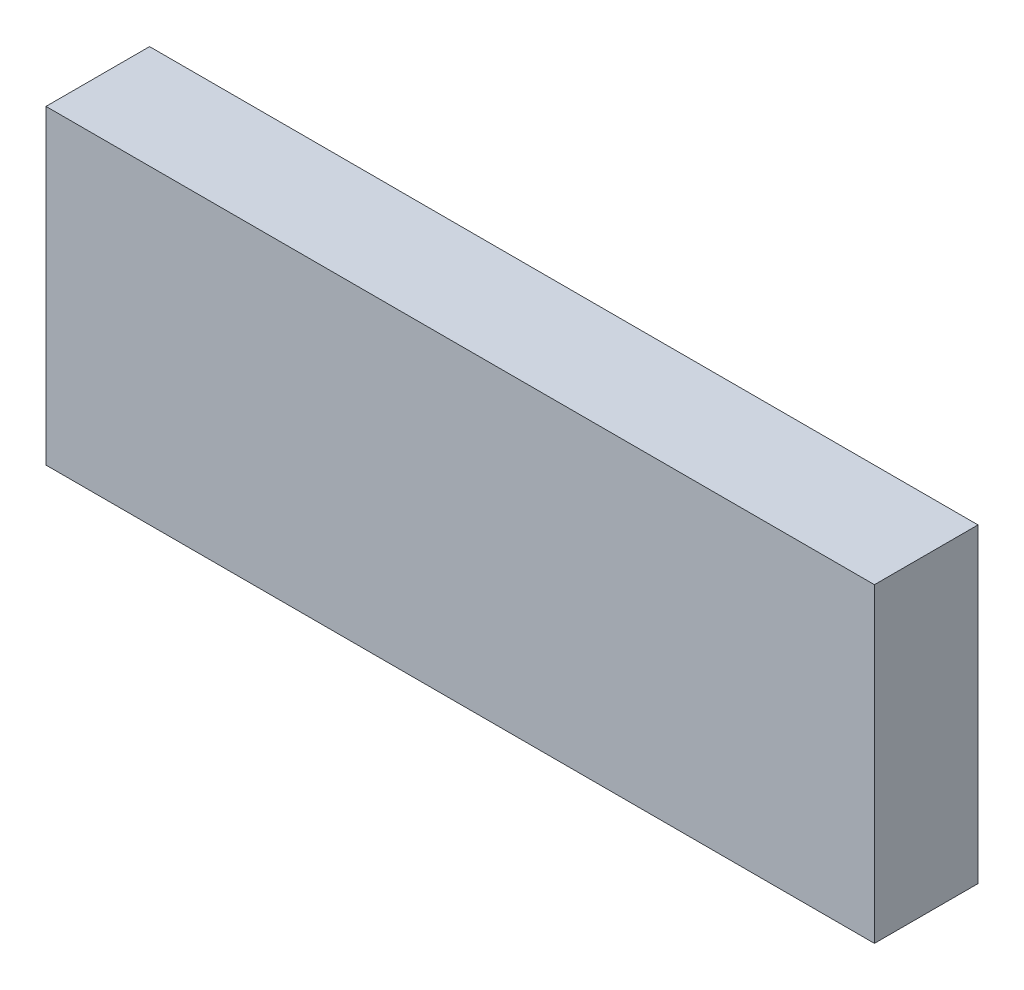
ISO-10303-21;
HEADER;
FILE_DESCRIPTION(('STEP AP214'),'2;1');
FILE_NAME('part.step','',(''),(''),'','','');
FILE_SCHEMA(('AUTOMOTIVE_DESIGN { 1 0 10303 214 1 1 1 1 }'));
ENDSEC;
DATA;
#1=APPLICATION_CONTEXT('core data for automotive mechanical design processes');
#2=APPLICATION_PROTOCOL_DEFINITION('international standard','automotive_design',2000,#1);
#3=PRODUCT_CONTEXT('',#1,'mechanical');
#4=PRODUCT('Part','Part','',(#3));
#5=PRODUCT_RELATED_PRODUCT_CATEGORY('part','',(#4));
#6=PRODUCT_DEFINITION_FORMATION('','',#4);
#7=PRODUCT_DEFINITION_CONTEXT('part definition',#1,'design');
#8=PRODUCT_DEFINITION('design','',#6,#7);
#9=PRODUCT_DEFINITION_SHAPE('','',#8);
#10=(LENGTH_UNIT() NAMED_UNIT(*) SI_UNIT(.MILLI.,.METRE.));
#11=(NAMED_UNIT(*) PLANE_ANGLE_UNIT() SI_UNIT($,.RADIAN.));
#12=(NAMED_UNIT(*) SI_UNIT($,.STERADIAN.) SOLID_ANGLE_UNIT());
#13=UNCERTAINTY_MEASURE_WITH_UNIT(LENGTH_MEASURE(1.E-05),#10,'distance_accuracy_value','');
#14=(GEOMETRIC_REPRESENTATION_CONTEXT(3) GLOBAL_UNCERTAINTY_ASSIGNED_CONTEXT((#13)) GLOBAL_UNIT_ASSIGNED_CONTEXT((#10,
#11,#12)) REPRESENTATION_CONTEXT('',''));
#15=CARTESIAN_POINT('',(0.,0.,0.));
#16=DIRECTION('',(0.,0.,1.));
#17=DIRECTION('',(1.,0.,0.));
#18=AXIS2_PLACEMENT_3D('',#15,#16,#17);
#19=CARTESIAN_POINT('',(342.,-70.,2.));
#20=DIRECTION('',(0.,0.,1.));
#21=DIRECTION('',(1.,0.,0.));
#22=AXIS2_PLACEMENT_3D('',#19,#20,#21);
#23=PLANE('',#22);
#24=DIRECTION('',(0.,1.,0.));
#25=VECTOR('',#24,1.);
#26=CARTESIAN_POINT('',(342.,-70.,2.));
#27=LINE('',#26,#25);
#28=CARTESIAN_POINT('',(342.,-70.,2.));
#29=VERTEX_POINT('',#28);
#30=CARTESIAN_POINT('',(342.,-64.,2.));
#31=VERTEX_POINT('',#30);
#32=EDGE_CURVE('E87',#29,#31,#27,.T.);
#33=ORIENTED_EDGE('',*,*,#32,.F.);
#34=DIRECTION('',(1.,0.,0.));
#35=VECTOR('',#34,1.);
#36=CARTESIAN_POINT('',(342.,-70.,2.));
#37=LINE('',#36,#35);
#38=CARTESIAN_POINT('',(358.,-70.,2.));
#39=VERTEX_POINT('',#38);
#40=EDGE_CURVE('E67',#29,#39,#37,.T.);
#41=ORIENTED_EDGE('',*,*,#40,.T.);
#42=DIRECTION('',(0.,1.,0.));
#43=VECTOR('',#42,1.);
#44=CARTESIAN_POINT('',(358.,-70.,2.));
#45=LINE('',#44,#43);
#46=CARTESIAN_POINT('',(358.,-64.,2.));
#47=VERTEX_POINT('',#46);
#48=EDGE_CURVE('E81',#39,#47,#45,.T.);
#49=ORIENTED_EDGE('',*,*,#48,.T.);
#50=DIRECTION('',(1.,0.,0.));
#51=VECTOR('',#50,1.);
#52=CARTESIAN_POINT('',(342.,-64.,2.));
#53=LINE('',#52,#51);
#54=EDGE_CURVE('E9',#31,#47,#53,.T.);
#55=ORIENTED_EDGE('',*,*,#54,.F.);
#56=EDGE_LOOP('',(#33,#41,#49,#55));
#57=FACE_BOUND('',#56,.T.);
#58=ADVANCED_FACE('F15',(#57),#23,.T.);
#59=CARTESIAN_POINT('',(342.,-70.,0.));
#60=DIRECTION('',(0.,0.,1.));
#61=DIRECTION('',(1.,0.,0.));
#62=AXIS2_PLACEMENT_3D('',#59,#60,#61);
#63=PLANE('',#62);
#64=DIRECTION('',(1.,0.,0.));
#65=VECTOR('',#64,1.);
#66=CARTESIAN_POINT('',(342.,-64.,0.));
#67=LINE('',#66,#65);
#68=CARTESIAN_POINT('',(342.,-64.,0.));
#69=VERTEX_POINT('',#68);
#70=CARTESIAN_POINT('',(358.,-64.,0.));
#71=VERTEX_POINT('',#70);
#72=EDGE_CURVE('E24',#69,#71,#67,.T.);
#73=ORIENTED_EDGE('',*,*,#72,.T.);
#74=DIRECTION('',(0.,1.,0.));
#75=VECTOR('',#74,1.);
#76=CARTESIAN_POINT('',(358.,-70.,0.));
#77=LINE('',#76,#75);
#78=CARTESIAN_POINT('',(358.,-70.,0.));
#79=VERTEX_POINT('',#78);
#80=EDGE_CURVE('E101',#79,#71,#77,.T.);
#81=ORIENTED_EDGE('',*,*,#80,.F.);
#82=DIRECTION('',(1.,0.,0.));
#83=VECTOR('',#82,1.);
#84=CARTESIAN_POINT('',(342.,-70.,0.));
#85=LINE('',#84,#83);
#86=CARTESIAN_POINT('',(342.,-70.,0.));
#87=VERTEX_POINT('',#86);
#88=EDGE_CURVE('E79',#87,#79,#85,.T.);
#89=ORIENTED_EDGE('',*,*,#88,.F.);
#90=DIRECTION('',(0.,1.,0.));
#91=VECTOR('',#90,1.);
#92=CARTESIAN_POINT('',(342.,-70.,0.));
#93=LINE('',#92,#91);
#94=EDGE_CURVE('E86',#87,#69,#93,.T.);
#95=ORIENTED_EDGE('',*,*,#94,.T.);
#96=EDGE_LOOP('',(#73,#81,#89,#95));
#97=FACE_BOUND('',#96,.T.);
#98=ADVANCED_FACE('F149',(#97),#63,.F.);
#99=CARTESIAN_POINT('',(342.,-64.,0.));
#100=DIRECTION('',(0.,1.,0.));
#101=DIRECTION('',(1.,0.,0.));
#102=AXIS2_PLACEMENT_3D('',#99,#100,#101);
#103=PLANE('',#102);
#104=ORIENTED_EDGE('',*,*,#72,.F.);
#105=DIRECTION('',(0.,0.,1.));
#106=VECTOR('',#105,1.);
#107=CARTESIAN_POINT('',(342.,-64.,0.));
#108=LINE('',#107,#106);
#109=EDGE_CURVE('E95',#69,#31,#108,.T.);
#110=ORIENTED_EDGE('',*,*,#109,.T.);
#111=ORIENTED_EDGE('',*,*,#54,.T.);
#112=DIRECTION('',(0.,0.,1.));
#113=VECTOR('',#112,1.);
#114=CARTESIAN_POINT('',(358.,-64.,0.));
#115=LINE('',#114,#113);
#116=EDGE_CURVE('E99',#71,#47,#115,.T.);
#117=ORIENTED_EDGE('',*,*,#116,.F.);
#118=EDGE_LOOP('',(#104,#110,#111,#117));
#119=FACE_BOUND('',#118,.T.);
#120=ADVANCED_FACE('F17',(#119),#103,.T.);
#121=CARTESIAN_POINT('',(342.,-70.,0.));
#122=DIRECTION('',(0.,1.,0.));
#123=DIRECTION('',(1.,0.,0.));
#124=AXIS2_PLACEMENT_3D('',#121,#122,#123);
#125=PLANE('',#124);
#126=DIRECTION('',(0.,0.,1.));
#127=VECTOR('',#126,1.);
#128=CARTESIAN_POINT('',(358.,-70.,0.));
#129=LINE('',#128,#127);
#130=EDGE_CURVE('E74',#79,#39,#129,.T.);
#131=ORIENTED_EDGE('',*,*,#130,.T.);
#132=ORIENTED_EDGE('',*,*,#40,.F.);
#133=DIRECTION('',(0.,0.,1.));
#134=VECTOR('',#133,1.);
#135=CARTESIAN_POINT('',(342.,-70.,0.));
#136=LINE('',#135,#134);
#137=EDGE_CURVE('E71',#87,#29,#136,.T.);
#138=ORIENTED_EDGE('',*,*,#137,.F.);
#139=ORIENTED_EDGE('',*,*,#88,.T.);
#140=EDGE_LOOP('',(#131,#132,#138,#139));
#141=FACE_BOUND('',#140,.T.);
#142=ADVANCED_FACE('F75',(#141),#125,.F.);
#143=CARTESIAN_POINT('',(358.,-70.,0.));
#144=DIRECTION('',(1.,0.,0.));
#145=DIRECTION('',(0.,1.,0.));
#146=AXIS2_PLACEMENT_3D('',#143,#144,#145);
#147=PLANE('',#146);
#148=ORIENTED_EDGE('',*,*,#130,.F.);
#149=ORIENTED_EDGE('',*,*,#80,.T.);
#150=ORIENTED_EDGE('',*,*,#116,.T.);
#151=ORIENTED_EDGE('',*,*,#48,.F.);
#152=EDGE_LOOP('',(#148,#149,#150,#151));
#153=FACE_BOUND('',#152,.T.);
#154=ADVANCED_FACE('F120',(#153),#147,.T.);
#155=CARTESIAN_POINT('',(342.,-70.,0.));
#156=DIRECTION('',(1.,0.,0.));
#157=DIRECTION('',(0.,1.,0.));
#158=AXIS2_PLACEMENT_3D('',#155,#156,#157);
#159=PLANE('',#158);
#160=ORIENTED_EDGE('',*,*,#32,.T.);
#161=ORIENTED_EDGE('',*,*,#109,.F.);
#162=ORIENTED_EDGE('',*,*,#94,.F.);
#163=ORIENTED_EDGE('',*,*,#137,.T.);
#164=EDGE_LOOP('',(#160,#161,#162,#163));
#165=FACE_BOUND('',#164,.T.);
#166=ADVANCED_FACE('F84',(#165),#159,.F.);
#167=CLOSED_SHELL('',(#58,#98,#120,#142,#154,#166));
#168=MANIFOLD_SOLID_BREP('B1',#167);
#169=ADVANCED_BREP_SHAPE_REPRESENTATION('',(#18,#168),#14);
#170=SHAPE_DEFINITION_REPRESENTATION(#9,#169);
ENDSEC;
END-ISO-10303-21;
